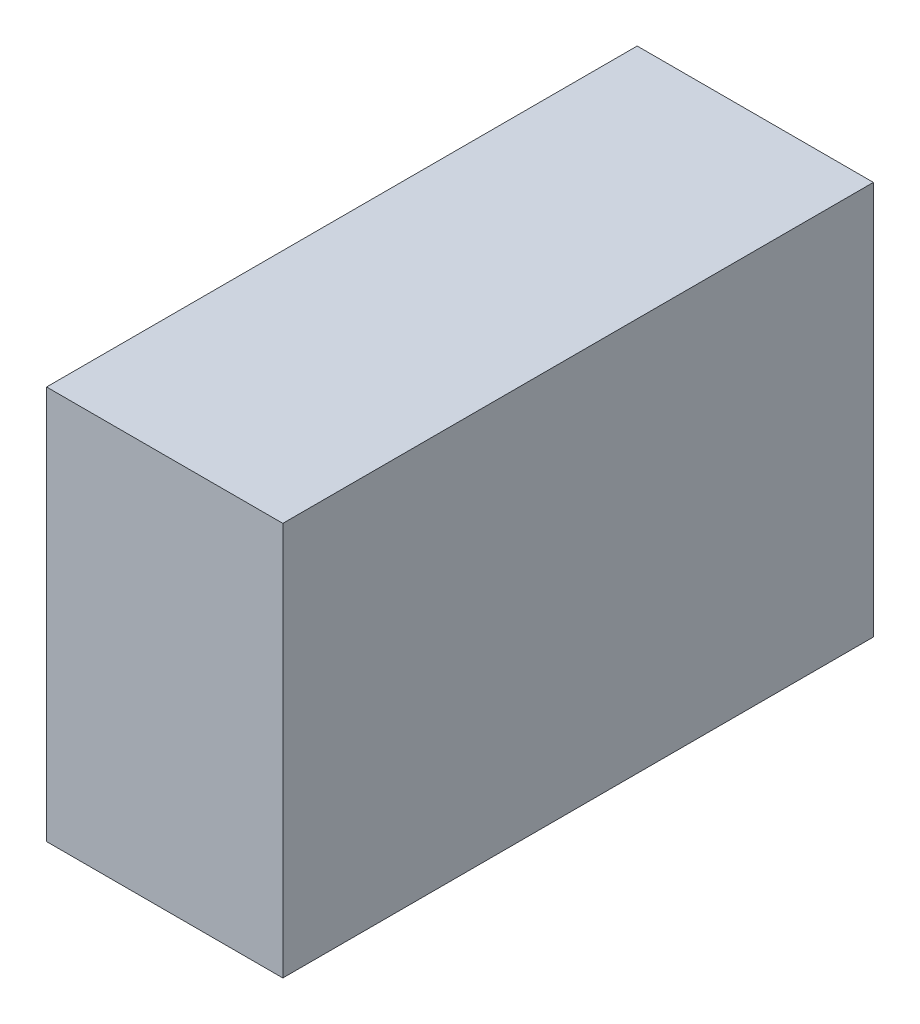
ISO-10303-21;
HEADER;
FILE_DESCRIPTION(('STEP AP214'),'2;1');
FILE_NAME('part.step','',(''),(''),'','','');
FILE_SCHEMA(('AUTOMOTIVE_DESIGN { 1 0 10303 214 1 1 1 1 }'));
ENDSEC;
DATA;
#1=APPLICATION_CONTEXT('core data for automotive mechanical design processes');
#2=APPLICATION_PROTOCOL_DEFINITION('international standard','automotive_design',2000,#1);
#3=PRODUCT_CONTEXT('',#1,'mechanical');
#4=PRODUCT('Part','Part','',(#3));
#5=PRODUCT_RELATED_PRODUCT_CATEGORY('part','',(#4));
#6=PRODUCT_DEFINITION_FORMATION('','',#4);
#7=PRODUCT_DEFINITION_CONTEXT('part definition',#1,'design');
#8=PRODUCT_DEFINITION('design','',#6,#7);
#9=PRODUCT_DEFINITION_SHAPE('','',#8);
#10=(LENGTH_UNIT() NAMED_UNIT(*) SI_UNIT(.MILLI.,.METRE.));
#11=(NAMED_UNIT(*) PLANE_ANGLE_UNIT() SI_UNIT($,.RADIAN.));
#12=(NAMED_UNIT(*) SI_UNIT($,.STERADIAN.) SOLID_ANGLE_UNIT());
#13=UNCERTAINTY_MEASURE_WITH_UNIT(LENGTH_MEASURE(1.E-05),#10,'distance_accuracy_value','');
#14=(GEOMETRIC_REPRESENTATION_CONTEXT(3) GLOBAL_UNCERTAINTY_ASSIGNED_CONTEXT((#13)) GLOBAL_UNIT_ASSIGNED_CONTEXT((#10,
#11,#12)) REPRESENTATION_CONTEXT('',''));
#15=CARTESIAN_POINT('',(0.,0.,0.));
#16=DIRECTION('',(0.,0.,1.));
#17=DIRECTION('',(1.,0.,0.));
#18=AXIS2_PLACEMENT_3D('',#15,#16,#17);
#19=CARTESIAN_POINT('',(6.,20.,15.));
#20=DIRECTION('',(-1.,0.,0.));
#21=DIRECTION('',(0.,0.,1.));
#22=AXIS2_PLACEMENT_3D('',#19,#20,#21);
#23=PLANE('',#22);
#24=DIRECTION('',(0.,0.,-1.));
#25=VECTOR('',#24,1.);
#26=CARTESIAN_POINT('',(6.,0.,15.));
#27=LINE('',#26,#25);
#28=CARTESIAN_POINT('',(6.,0.,15.));
#29=VERTEX_POINT('',#28);
#30=CARTESIAN_POINT('',(6.,0.,-15.));
#31=VERTEX_POINT('',#30);
#32=EDGE_CURVE('E113',#29,#31,#27,.T.);
#33=ORIENTED_EDGE('',*,*,#32,.T.);
#34=DIRECTION('',(0.,-1.,0.));
#35=VECTOR('',#34,1.);
#36=CARTESIAN_POINT('',(6.,20.,-15.));
#37=LINE('',#36,#35);
#38=CARTESIAN_POINT('',(6.,20.,-15.));
#39=VERTEX_POINT('',#38);
#40=EDGE_CURVE('E11',#39,#31,#37,.T.);
#41=ORIENTED_EDGE('',*,*,#40,.F.);
#42=DIRECTION('',(0.,0.,-1.));
#43=VECTOR('',#42,1.);
#44=CARTESIAN_POINT('',(6.,20.,15.));
#45=LINE('',#44,#43);
#46=CARTESIAN_POINT('',(6.,20.,15.));
#47=VERTEX_POINT('',#46);
#48=EDGE_CURVE('E97',#47,#39,#45,.T.);
#49=ORIENTED_EDGE('',*,*,#48,.F.);
#50=DIRECTION('',(0.,-1.,0.));
#51=VECTOR('',#50,1.);
#52=CARTESIAN_POINT('',(6.,20.,15.));
#53=LINE('',#52,#51);
#54=EDGE_CURVE('E109',#47,#29,#53,.T.);
#55=ORIENTED_EDGE('',*,*,#54,.T.);
#56=EDGE_LOOP('',(#33,#41,#49,#55));
#57=FACE_BOUND('',#56,.T.);
#58=ADVANCED_FACE('F45',(#57),#23,.F.);
#59=CARTESIAN_POINT('',(-6.,20.,-15.));
#60=DIRECTION('',(0.,0.,1.));
#61=DIRECTION('',(1.,0.,0.));
#62=AXIS2_PLACEMENT_3D('',#59,#60,#61);
#63=PLANE('',#62);
#64=DIRECTION('',(-1.,0.,0.));
#65=VECTOR('',#64,1.);
#66=CARTESIAN_POINT('',(-6.,0.,-15.));
#67=LINE('',#66,#65);
#68=CARTESIAN_POINT('',(-6.,0.,-15.));
#69=VERTEX_POINT('',#68);
#70=EDGE_CURVE('E102',#31,#69,#67,.T.);
#71=ORIENTED_EDGE('',*,*,#70,.T.);
#72=DIRECTION('',(0.,-1.,0.));
#73=VECTOR('',#72,1.);
#74=CARTESIAN_POINT('',(-6.,20.,-15.));
#75=LINE('',#74,#73);
#76=CARTESIAN_POINT('',(-6.,20.,-15.));
#77=VERTEX_POINT('',#76);
#78=EDGE_CURVE('E54',#77,#69,#75,.T.);
#79=ORIENTED_EDGE('',*,*,#78,.F.);
#80=DIRECTION('',(-1.,0.,0.));
#81=VECTOR('',#80,1.);
#82=CARTESIAN_POINT('',(-6.,20.,-15.));
#83=LINE('',#82,#81);
#84=EDGE_CURVE('E92',#39,#77,#83,.T.);
#85=ORIENTED_EDGE('',*,*,#84,.F.);
#86=ORIENTED_EDGE('',*,*,#40,.T.);
#87=EDGE_LOOP('',(#71,#79,#85,#86));
#88=FACE_BOUND('',#87,.T.);
#89=ADVANCED_FACE('F101',(#88),#63,.F.);
#90=CARTESIAN_POINT('',(-6.,20.,15.));
#91=DIRECTION('',(1.,0.,0.));
#92=DIRECTION('',(0.,0.,-1.));
#93=AXIS2_PLACEMENT_3D('',#90,#91,#92);
#94=PLANE('',#93);
#95=DIRECTION('',(0.,0.,1.));
#96=VECTOR('',#95,1.);
#97=CARTESIAN_POINT('',(-6.,0.,15.));
#98=LINE('',#97,#96);
#99=CARTESIAN_POINT('',(-6.,0.,15.));
#100=VERTEX_POINT('',#99);
#101=EDGE_CURVE('E79',#69,#100,#98,.T.);
#102=ORIENTED_EDGE('',*,*,#101,.T.);
#103=DIRECTION('',(0.,-1.,0.));
#104=VECTOR('',#103,1.);
#105=CARTESIAN_POINT('',(-6.,20.,15.));
#106=LINE('',#105,#104);
#107=CARTESIAN_POINT('',(-6.,20.,15.));
#108=VERTEX_POINT('',#107);
#109=EDGE_CURVE('E104',#108,#100,#106,.T.);
#110=ORIENTED_EDGE('',*,*,#109,.F.);
#111=DIRECTION('',(0.,0.,1.));
#112=VECTOR('',#111,1.);
#113=CARTESIAN_POINT('',(-6.,20.,15.));
#114=LINE('',#113,#112);
#115=EDGE_CURVE('E95',#77,#108,#114,.T.);
#116=ORIENTED_EDGE('',*,*,#115,.F.);
#117=ORIENTED_EDGE('',*,*,#78,.T.);
#118=EDGE_LOOP('',(#102,#110,#116,#117));
#119=FACE_BOUND('',#118,.T.);
#120=ADVANCED_FACE('F105',(#119),#94,.F.);
#121=CARTESIAN_POINT('',(-6.,20.,15.));
#122=DIRECTION('',(0.,0.,-1.));
#123=DIRECTION('',(-1.,0.,0.));
#124=AXIS2_PLACEMENT_3D('',#121,#122,#123);
#125=PLANE('',#124);
#126=DIRECTION('',(1.,0.,0.));
#127=VECTOR('',#126,1.);
#128=CARTESIAN_POINT('',(-6.,0.,15.));
#129=LINE('',#128,#127);
#130=EDGE_CURVE('E85',#100,#29,#129,.T.);
#131=ORIENTED_EDGE('',*,*,#130,.T.);
#132=ORIENTED_EDGE('',*,*,#54,.F.);
#133=DIRECTION('',(1.,0.,0.));
#134=VECTOR('',#133,1.);
#135=CARTESIAN_POINT('',(-6.,20.,15.));
#136=LINE('',#135,#134);
#137=EDGE_CURVE('E62',#108,#47,#136,.T.);
#138=ORIENTED_EDGE('',*,*,#137,.F.);
#139=ORIENTED_EDGE('',*,*,#109,.T.);
#140=EDGE_LOOP('',(#131,#132,#138,#139));
#141=FACE_BOUND('',#140,.T.);
#142=ADVANCED_FACE('F126',(#141),#125,.F.);
#143=CARTESIAN_POINT('',(0.,20.,0.));
#144=DIRECTION('',(0.,-1.,0.));
#145=DIRECTION('',(0.,0.,-1.));
#146=AXIS2_PLACEMENT_3D('',#143,#144,#145);
#147=PLANE('',#146);
#148=ORIENTED_EDGE('',*,*,#48,.T.);
#149=ORIENTED_EDGE('',*,*,#84,.T.);
#150=ORIENTED_EDGE('',*,*,#115,.T.);
#151=ORIENTED_EDGE('',*,*,#137,.T.);
#152=EDGE_LOOP('',(#148,#149,#150,#151));
#153=FACE_BOUND('',#152,.T.);
#154=ADVANCED_FACE('F93',(#153),#147,.F.);
#155=CARTESIAN_POINT('',(0.,0.,0.));
#156=DIRECTION('',(0.,-1.,0.));
#157=DIRECTION('',(0.,0.,-1.));
#158=AXIS2_PLACEMENT_3D('',#155,#156,#157);
#159=PLANE('',#158);
#160=ORIENTED_EDGE('',*,*,#32,.F.);
#161=ORIENTED_EDGE('',*,*,#130,.F.);
#162=ORIENTED_EDGE('',*,*,#101,.F.);
#163=ORIENTED_EDGE('',*,*,#70,.F.);
#164=EDGE_LOOP('',(#160,#161,#162,#163));
#165=FACE_BOUND('',#164,.T.);
#166=ADVANCED_FACE('F129',(#165),#159,.T.);
#167=CLOSED_SHELL('',(#58,#89,#120,#142,#154,#166));
#168=MANIFOLD_SOLID_BREP('B2',#167);
#169=ADVANCED_BREP_SHAPE_REPRESENTATION('',(#18,#168),#14);
#170=SHAPE_DEFINITION_REPRESENTATION(#9,#169);
ENDSEC;
END-ISO-10303-21;
